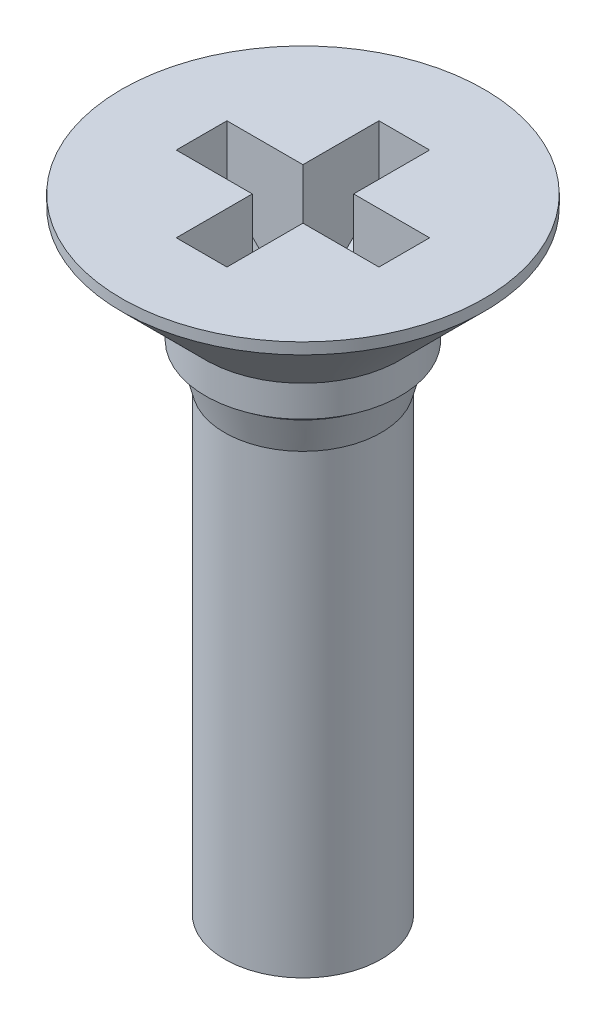
ISO-10303-21;
HEADER;
FILE_DESCRIPTION(('STEP AP214'),'2;1');
FILE_NAME('part.step','',(''),(''),'','','');
FILE_SCHEMA(('AUTOMOTIVE_DESIGN { 1 0 10303 214 1 1 1 1 }'));
ENDSEC;
DATA;
#1=APPLICATION_CONTEXT('core data for automotive mechanical design processes');
#2=APPLICATION_PROTOCOL_DEFINITION('international standard','automotive_design',2000,#1);
#3=PRODUCT_CONTEXT('',#1,'mechanical');
#4=PRODUCT('Part','Part','',(#3));
#5=PRODUCT_RELATED_PRODUCT_CATEGORY('part','',(#4));
#6=PRODUCT_DEFINITION_FORMATION('','',#4);
#7=PRODUCT_DEFINITION_CONTEXT('part definition',#1,'design');
#8=PRODUCT_DEFINITION('design','',#6,#7);
#9=PRODUCT_DEFINITION_SHAPE('','',#8);
#10=(LENGTH_UNIT() NAMED_UNIT(*) SI_UNIT(.MILLI.,.METRE.));
#11=(NAMED_UNIT(*) PLANE_ANGLE_UNIT() SI_UNIT($,.RADIAN.));
#12=(NAMED_UNIT(*) SI_UNIT($,.STERADIAN.) SOLID_ANGLE_UNIT());
#13=UNCERTAINTY_MEASURE_WITH_UNIT(LENGTH_MEASURE(1.E-05),#10,'distance_accuracy_value','');
#14=(GEOMETRIC_REPRESENTATION_CONTEXT(3) GLOBAL_UNCERTAINTY_ASSIGNED_CONTEXT((#13)) GLOBAL_UNIT_ASSIGNED_CONTEXT((#10,
#11,#12)) REPRESENTATION_CONTEXT('',''));
#15=CARTESIAN_POINT('',(0.,0.,0.));
#16=DIRECTION('',(0.,0.,1.));
#17=DIRECTION('',(1.,0.,0.));
#18=AXIS2_PLACEMENT_3D('',#15,#16,#17);
#19=CARTESIAN_POINT('',(0.,-4.2,-0.65));
#20=DIRECTION('',(0.,0.,-1.));
#21=DIRECTION('',(-1.,0.,0.));
#22=AXIS2_PLACEMENT_3D('',#19,#20,#21);
#23=PLANE('',#22);
#24=DIRECTION('',(0.,1.,0.));
#25=VECTOR('',#24,1.);
#26=CARTESIAN_POINT('',(0.65,-4.2,-0.65));
#27=LINE('',#26,#25);
#28=CARTESIAN_POINT('',(0.65,-3.2,-0.65));
#29=VERTEX_POINT('',#28);
#30=CARTESIAN_POINT('',(0.65,0.,-0.65));
#31=VERTEX_POINT('',#30);
#32=EDGE_CURVE('E197',#29,#31,#27,.T.);
#33=ORIENTED_EDGE('',*,*,#32,.F.);
#34=DIRECTION('',(1.,0.,0.));
#35=VECTOR('',#34,1.);
#36=CARTESIAN_POINT('',(-1.,-3.2,-0.65));
#37=LINE('',#36,#35);
#38=CARTESIAN_POINT('',(1.,-3.2,-0.65));
#39=VERTEX_POINT('',#38);
#40=EDGE_CURVE('E232',#29,#39,#37,.T.);
#41=ORIENTED_EDGE('',*,*,#40,.T.);
#42=DIRECTION('',(0.707106781186547,0.707106781186548,0.));
#43=VECTOR('',#42,1.);
#44=CARTESIAN_POINT('',(2.6,-1.6,-0.65));
#45=LINE('',#44,#43);
#46=CARTESIAN_POINT('',(2.6,-1.6,-0.65));
#47=VERTEX_POINT('',#46);
#48=EDGE_CURVE('E236',#39,#47,#45,.T.);
#49=ORIENTED_EDGE('',*,*,#48,.T.);
#50=DIRECTION('',(0.,1.,0.));
#51=VECTOR('',#50,1.);
#52=CARTESIAN_POINT('',(2.6,0.,-0.65));
#53=LINE('',#52,#51);
#54=CARTESIAN_POINT('',(2.6,0.,-0.65));
#55=VERTEX_POINT('',#54);
#56=EDGE_CURVE('E239',#47,#55,#53,.T.);
#57=ORIENTED_EDGE('',*,*,#56,.T.);
#58=DIRECTION('',(-1.,0.,0.));
#59=VECTOR('',#58,1.);
#60=CARTESIAN_POINT('',(2.6,0.,-0.65));
#61=LINE('',#60,#59);
#62=EDGE_CURVE('E243',#55,#31,#61,.T.);
#63=ORIENTED_EDGE('',*,*,#62,.T.);
#64=EDGE_LOOP('',(#33,#41,#49,#57,#63));
#65=FACE_BOUND('',#64,.T.);
#66=ADVANCED_FACE('F35',(#65),#23,.F.);
#67=CARTESIAN_POINT('',(0.,-4.2,0.65));
#68=DIRECTION('',(0.,0.,-1.));
#69=DIRECTION('',(-1.,0.,0.));
#70=AXIS2_PLACEMENT_3D('',#67,#68,#69);
#71=PLANE('',#70);
#72=DIRECTION('',(1.,0.,0.));
#73=VECTOR('',#72,1.);
#74=CARTESIAN_POINT('',(-1.,-3.2,0.65));
#75=LINE('',#74,#73);
#76=CARTESIAN_POINT('',(0.65,-3.2,0.65));
#77=VERTEX_POINT('',#76);
#78=CARTESIAN_POINT('',(1.,-3.2,0.65));
#79=VERTEX_POINT('',#78);
#80=EDGE_CURVE('E214',#77,#79,#75,.T.);
#81=ORIENTED_EDGE('',*,*,#80,.F.);
#82=DIRECTION('',(0.,1.,0.));
#83=VECTOR('',#82,1.);
#84=CARTESIAN_POINT('',(0.65,-4.2,0.65));
#85=LINE('',#84,#83);
#86=CARTESIAN_POINT('',(0.65,0.,0.65));
#87=VERTEX_POINT('',#86);
#88=EDGE_CURVE('E43',#77,#87,#85,.T.);
#89=ORIENTED_EDGE('',*,*,#88,.T.);
#90=DIRECTION('',(-1.,0.,0.));
#91=VECTOR('',#90,1.);
#92=CARTESIAN_POINT('',(2.6,0.,0.65));
#93=LINE('',#92,#91);
#94=CARTESIAN_POINT('',(2.6,0.,0.65));
#95=VERTEX_POINT('',#94);
#96=EDGE_CURVE('E223',#95,#87,#93,.T.);
#97=ORIENTED_EDGE('',*,*,#96,.F.);
#98=DIRECTION('',(0.,1.,0.));
#99=VECTOR('',#98,1.);
#100=CARTESIAN_POINT('',(2.6,0.,0.65));
#101=LINE('',#100,#99);
#102=CARTESIAN_POINT('',(2.6,-1.6,0.65));
#103=VERTEX_POINT('',#102);
#104=EDGE_CURVE('E220',#103,#95,#101,.T.);
#105=ORIENTED_EDGE('',*,*,#104,.F.);
#106=DIRECTION('',(0.707106781186547,0.707106781186548,0.));
#107=VECTOR('',#106,1.);
#108=CARTESIAN_POINT('',(2.6,-1.6,0.65));
#109=LINE('',#108,#107);
#110=EDGE_CURVE('E217',#79,#103,#109,.T.);
#111=ORIENTED_EDGE('',*,*,#110,.F.);
#112=EDGE_LOOP('',(#81,#89,#97,#105,#111));
#113=FACE_BOUND('',#112,.T.);
#114=ADVANCED_FACE('F289',(#113),#71,.T.);
#115=CARTESIAN_POINT('',(0.,0.,0.));
#116=DIRECTION('',(0.,-1.,0.));
#117=DIRECTION('',(1.,0.,0.));
#118=AXIS2_PLACEMENT_3D('',#115,#116,#117);
#119=PLANE('',#118);
#120=DIRECTION('',(1.,0.,0.));
#121=VECTOR('',#120,1.);
#122=CARTESIAN_POINT('',(-0.65,0.,2.6));
#123=LINE('',#122,#121);
#124=CARTESIAN_POINT('',(-0.65,0.,2.6));
#125=VERTEX_POINT('',#124);
#126=CARTESIAN_POINT('',(0.65,0.,2.6));
#127=VERTEX_POINT('',#126);
#128=EDGE_CURVE('E198',#125,#127,#123,.T.);
#129=ORIENTED_EDGE('',*,*,#128,.F.);
#130=DIRECTION('',(0.,0.,1.));
#131=VECTOR('',#130,1.);
#132=CARTESIAN_POINT('',(-0.65,0.,-2.6));
#133=LINE('',#132,#131);
#134=CARTESIAN_POINT('',(-0.65,0.,0.65));
#135=VERTEX_POINT('',#134);
#136=EDGE_CURVE('E191',#135,#125,#133,.T.);
#137=ORIENTED_EDGE('',*,*,#136,.F.);
#138=CARTESIAN_POINT('',(-2.6,0.,0.65));
#139=VERTEX_POINT('',#138);
#140=EDGE_CURVE('E222',#135,#139,#93,.T.);
#141=ORIENTED_EDGE('',*,*,#140,.T.);
#142=DIRECTION('',(0.,0.,1.));
#143=VECTOR('',#142,1.);
#144=CARTESIAN_POINT('',(-2.6,0.,-0.65));
#145=LINE('',#144,#143);
#146=CARTESIAN_POINT('',(-2.6,0.,-0.65));
#147=VERTEX_POINT('',#146);
#148=EDGE_CURVE('E253',#147,#139,#145,.T.);
#149=ORIENTED_EDGE('',*,*,#148,.F.);
#150=CARTESIAN_POINT('',(-0.65,0.,-0.65));
#151=VERTEX_POINT('',#150);
#152=EDGE_CURVE('E242',#151,#147,#61,.T.);
#153=ORIENTED_EDGE('',*,*,#152,.F.);
#154=CARTESIAN_POINT('',(-0.65,0.,-2.6));
#155=VERTEX_POINT('',#154);
#156=EDGE_CURVE('E192',#155,#151,#133,.T.);
#157=ORIENTED_EDGE('',*,*,#156,.F.);
#158=DIRECTION('',(1.,0.,0.));
#159=VECTOR('',#158,1.);
#160=CARTESIAN_POINT('',(-0.65,0.,-2.6));
#161=LINE('',#160,#159);
#162=CARTESIAN_POINT('',(0.65,0.,-2.6));
#163=VERTEX_POINT('',#162);
#164=EDGE_CURVE('E200',#155,#163,#161,.T.);
#165=ORIENTED_EDGE('',*,*,#164,.T.);
#166=DIRECTION('',(0.,0.,1.));
#167=VECTOR('',#166,1.);
#168=CARTESIAN_POINT('',(0.65,0.,-2.6));
#169=LINE('',#168,#167);
#170=EDGE_CURVE('E176',#163,#31,#169,.T.);
#171=ORIENTED_EDGE('',*,*,#170,.T.);
#172=ORIENTED_EDGE('',*,*,#62,.F.);
#173=DIRECTION('',(0.,0.,1.));
#174=VECTOR('',#173,1.);
#175=CARTESIAN_POINT('',(2.6,0.,-0.65));
#176=LINE('',#175,#174);
#177=EDGE_CURVE('E256',#55,#95,#176,.T.);
#178=ORIENTED_EDGE('',*,*,#177,.T.);
#179=ORIENTED_EDGE('',*,*,#96,.T.);
#180=EDGE_CURVE('E58',#87,#127,#169,.T.);
#181=ORIENTED_EDGE('',*,*,#180,.T.);
#182=EDGE_LOOP('',(#129,#137,#141,#149,#153,#157,#165,#171,#172,#178,#179,#181));
#183=FACE_BOUND('',#182,.T.);
#184=CARTESIAN_POINT('',(0.,0.,0.));
#185=DIRECTION('',(0.,1.,0.));
#186=DIRECTION('',(-1.,0.,0.));
#187=AXIS2_PLACEMENT_3D('',#184,#185,#186);
#188=CIRCLE('',#187,4.65);
#189=CARTESIAN_POINT('',(-4.65,0.,0.));
#190=VERTEX_POINT('',#189);
#191=EDGE_CURVE('E285',#190,#190,#188,.T.);
#192=ORIENTED_EDGE('',*,*,#191,.T.);
#193=EDGE_LOOP('',(#192));
#194=FACE_BOUND('',#193,.T.);
#195=ADVANCED_FACE('F37',(#183,#194),#119,.F.);
#196=CARTESIAN_POINT('',(0.,0.,0.));
#197=DIRECTION('',(0.,1.,0.));
#198=DIRECTION('',(-1.,0.,0.));
#199=AXIS2_PLACEMENT_3D('',#196,#197,#198);
#200=CYLINDRICAL_SURFACE('',#199,4.65);
#201=ORIENTED_EDGE('',*,*,#191,.F.);
#202=EDGE_LOOP('',(#201));
#203=FACE_BOUND('',#202,.T.);
#204=CARTESIAN_POINT('',(0.,-0.290000000000009,0.));
#205=DIRECTION('',(0.,1.,0.));
#206=DIRECTION('',(-1.,0.,0.));
#207=AXIS2_PLACEMENT_3D('',#204,#205,#206);
#208=CIRCLE('',#207,4.65);
#209=CARTESIAN_POINT('',(-4.65,-0.290000000000009,0.));
#210=VERTEX_POINT('',#209);
#211=EDGE_CURVE('E282',#210,#210,#208,.T.);
#212=ORIENTED_EDGE('',*,*,#211,.T.);
#213=EDGE_LOOP('',(#212));
#214=FACE_BOUND('',#213,.T.);
#215=ADVANCED_FACE('F398',(#203,#214),#200,.T.);
#216=CARTESIAN_POINT('',(0.,-2.44,0.));
#217=DIRECTION('',(0.,1.,0.));
#218=DIRECTION('',(-1.,0.,0.));
#219=AXIS2_PLACEMENT_3D('',#216,#217,#218);
#220=CONICAL_SURFACE('',#219,2.5,0.78539816339745);
#221=ORIENTED_EDGE('',*,*,#211,.F.);
#222=EDGE_LOOP('',(#221));
#223=FACE_BOUND('',#222,.T.);
#224=CARTESIAN_POINT('',(0.,-2.44,0.));
#225=DIRECTION('',(0.,1.,0.));
#226=DIRECTION('',(-1.,0.,0.));
#227=AXIS2_PLACEMENT_3D('',#224,#225,#226);
#228=CIRCLE('',#227,2.5);
#229=CARTESIAN_POINT('',(-2.5,-2.44,0.));
#230=VERTEX_POINT('',#229);
#231=EDGE_CURVE('E279',#230,#230,#228,.T.);
#232=ORIENTED_EDGE('',*,*,#231,.T.);
#233=EDGE_LOOP('',(#232));
#234=FACE_BOUND('',#233,.T.);
#235=ADVANCED_FACE('F395',(#223,#234),#220,.T.);
#236=CARTESIAN_POINT('',(0.,0.,0.));
#237=DIRECTION('',(0.,1.,0.));
#238=DIRECTION('',(-1.,0.,0.));
#239=AXIS2_PLACEMENT_3D('',#236,#237,#238);
#240=CYLINDRICAL_SURFACE('',#239,2.5);
#241=ORIENTED_EDGE('',*,*,#231,.F.);
#242=EDGE_LOOP('',(#241));
#243=FACE_BOUND('',#242,.T.);
#244=CARTESIAN_POINT('',(0.,-3.24,0.));
#245=DIRECTION('',(0.,1.,0.));
#246=DIRECTION('',(-1.,0.,0.));
#247=AXIS2_PLACEMENT_3D('',#244,#245,#246);
#248=CIRCLE('',#247,2.5);
#249=CARTESIAN_POINT('',(-2.5,-3.24,0.));
#250=VERTEX_POINT('',#249);
#251=EDGE_CURVE('E276',#250,#250,#248,.T.);
#252=ORIENTED_EDGE('',*,*,#251,.T.);
#253=EDGE_LOOP('',(#252));
#254=FACE_BOUND('',#253,.T.);
#255=ADVANCED_FACE('F391',(#243,#254),#240,.T.);
#256=CARTESIAN_POINT('',(2.5,-3.24,0.));
#257=DIRECTION('',(0.,1.,0.));
#258=DIRECTION('',(-1.,0.,0.));
#259=AXIS2_PLACEMENT_3D('',#256,#257,#258);
#260=PLANE('',#259);
#261=ORIENTED_EDGE('',*,*,#251,.F.);
#262=EDGE_LOOP('',(#261));
#263=FACE_BOUND('',#262,.T.);
#264=CARTESIAN_POINT('',(0.,-3.24,0.));
#265=DIRECTION('',(0.,1.,0.));
#266=DIRECTION('',(-1.,0.,0.));
#267=AXIS2_PLACEMENT_3D('',#264,#265,#266);
#268=CIRCLE('',#267,2.24);
#269=CARTESIAN_POINT('',(-2.24,-3.24,0.));
#270=VERTEX_POINT('',#269);
#271=EDGE_CURVE('E273',#270,#270,#268,.T.);
#272=ORIENTED_EDGE('',*,*,#271,.T.);
#273=EDGE_LOOP('',(#272));
#274=FACE_BOUND('',#273,.T.);
#275=ADVANCED_FACE('F387',(#263,#274),#260,.F.);
#276=CARTESIAN_POINT('',(0.,0.,0.));
#277=DIRECTION('',(0.,1.,0.));
#278=DIRECTION('',(-1.,0.,0.));
#279=AXIS2_PLACEMENT_3D('',#276,#277,#278);
#280=CYLINDRICAL_SURFACE('',#279,2.24);
#281=ORIENTED_EDGE('',*,*,#271,.F.);
#282=EDGE_LOOP('',(#281));
#283=FACE_BOUND('',#282,.T.);
#284=CARTESIAN_POINT('',(0.,-3.43976228885538,0.));
#285=DIRECTION('',(0.,1.,0.));
#286=DIRECTION('',(-1.,0.,0.));
#287=AXIS2_PLACEMENT_3D('',#284,#285,#286);
#288=CIRCLE('',#287,2.24);
#289=CARTESIAN_POINT('',(-2.24,-3.43976228885538,0.));
#290=VERTEX_POINT('',#289);
#291=EDGE_CURVE('E270',#290,#290,#288,.T.);
#292=ORIENTED_EDGE('',*,*,#291,.T.);
#293=EDGE_LOOP('',(#292));
#294=FACE_BOUND('',#293,.T.);
#295=ADVANCED_FACE('F383',(#283,#294),#280,.T.);
#296=CARTESIAN_POINT('',(0.,-4.3,0.));
#297=DIRECTION('',(0.,1.,0.));
#298=DIRECTION('',(-1.,0.,0.));
#299=AXIS2_PLACEMENT_3D('',#296,#297,#298);
#300=CONICAL_SURFACE('',#299,2.0095,0.26179938779915);
#301=ORIENTED_EDGE('',*,*,#291,.F.);
#302=EDGE_LOOP('',(#301));
#303=FACE_BOUND('',#302,.T.);
#304=CARTESIAN_POINT('',(0.,-4.3,0.));
#305=DIRECTION('',(0.,1.,0.));
#306=DIRECTION('',(-1.,0.,0.));
#307=AXIS2_PLACEMENT_3D('',#304,#305,#306);
#308=CIRCLE('',#307,2.0095);
#309=CARTESIAN_POINT('',(-2.0095,-4.3,0.));
#310=VERTEX_POINT('',#309);
#311=EDGE_CURVE('E267',#310,#310,#308,.T.);
#312=ORIENTED_EDGE('',*,*,#311,.T.);
#313=EDGE_LOOP('',(#312));
#314=FACE_BOUND('',#313,.T.);
#315=ADVANCED_FACE('F379',(#303,#314),#300,.T.);
#316=CARTESIAN_POINT('',(0.,0.,0.));
#317=DIRECTION('',(0.,1.,0.));
#318=DIRECTION('',(-1.,0.,0.));
#319=AXIS2_PLACEMENT_3D('',#316,#317,#318);
#320=CYLINDRICAL_SURFACE('',#319,2.0095);
#321=ORIENTED_EDGE('',*,*,#311,.F.);
#322=EDGE_LOOP('',(#321));
#323=FACE_BOUND('',#322,.T.);
#324=CARTESIAN_POINT('',(0.,-16.,0.));
#325=DIRECTION('',(0.,1.,0.));
#326=DIRECTION('',(-1.,0.,0.));
#327=AXIS2_PLACEMENT_3D('',#324,#325,#326);
#328=CIRCLE('',#327,2.0095);
#329=CARTESIAN_POINT('',(-2.0095,-16.,0.));
#330=VERTEX_POINT('',#329);
#331=EDGE_CURVE('E252',#330,#330,#328,.T.);
#332=ORIENTED_EDGE('',*,*,#331,.T.);
#333=EDGE_LOOP('',(#332));
#334=FACE_BOUND('',#333,.T.);
#335=ADVANCED_FACE('F375',(#323,#334),#320,.T.);
#336=CARTESIAN_POINT('',(2.0095,-16.,0.));
#337=DIRECTION('',(0.,1.,0.));
#338=DIRECTION('',(-1.,0.,0.));
#339=AXIS2_PLACEMENT_3D('',#336,#337,#338);
#340=PLANE('',#339);
#341=ORIENTED_EDGE('',*,*,#331,.F.);
#342=EDGE_LOOP('',(#341));
#343=FACE_BOUND('',#342,.T.);
#344=ADVANCED_FACE('F372',(#343),#340,.F.);
#345=CARTESIAN_POINT('',(-2.6,-1.6,-0.65));
#346=DIRECTION('',(-0.707106781186548,-0.707106781186547,0.));
#347=DIRECTION('',(0.707106781186547,-0.707106781186548,0.));
#348=AXIS2_PLACEMENT_3D('',#345,#346,#347);
#349=PLANE('',#348);
#350=DIRECTION('',(0.,0.,1.));
#351=VECTOR('',#350,1.);
#352=CARTESIAN_POINT('',(-1.,-3.2,-0.65));
#353=LINE('',#352,#351);
#354=CARTESIAN_POINT('',(-1.,-3.2,-0.65));
#355=VERTEX_POINT('',#354);
#356=CARTESIAN_POINT('',(-1.,-3.2,0.65));
#357=VERTEX_POINT('',#356);
#358=EDGE_CURVE('E249',#355,#357,#353,.T.);
#359=ORIENTED_EDGE('',*,*,#358,.F.);
#360=DIRECTION('',(0.707106781186547,-0.707106781186548,0.));
#361=VECTOR('',#360,1.);
#362=CARTESIAN_POINT('',(-2.6,-1.6,-0.65));
#363=LINE('',#362,#361);
#364=CARTESIAN_POINT('',(-2.6,-1.6,-0.65));
#365=VERTEX_POINT('',#364);
#366=EDGE_CURVE('E229',#365,#355,#363,.T.);
#367=ORIENTED_EDGE('',*,*,#366,.F.);
#368=DIRECTION('',(0.,0.,1.));
#369=VECTOR('',#368,1.);
#370=CARTESIAN_POINT('',(-2.6,-1.6,-0.65));
#371=LINE('',#370,#369);
#372=CARTESIAN_POINT('',(-2.6,-1.6,0.65));
#373=VERTEX_POINT('',#372);
#374=EDGE_CURVE('E250',#365,#373,#371,.T.);
#375=ORIENTED_EDGE('',*,*,#374,.T.);
#376=DIRECTION('',(0.707106781186547,-0.707106781186548,0.));
#377=VECTOR('',#376,1.);
#378=CARTESIAN_POINT('',(-2.6,-1.6,0.65));
#379=LINE('',#378,#377);
#380=EDGE_CURVE('E211',#373,#357,#379,.T.);
#381=ORIENTED_EDGE('',*,*,#380,.T.);
#382=EDGE_LOOP('',(#359,#367,#375,#381));
#383=FACE_BOUND('',#382,.T.);
#384=ADVANCED_FACE('F326',(#383),#349,.F.);
#385=CARTESIAN_POINT('',(-2.6,0.,-0.65));
#386=DIRECTION('',(-1.,0.,0.));
#387=DIRECTION('',(0.,0.,1.));
#388=AXIS2_PLACEMENT_3D('',#385,#386,#387);
#389=PLANE('',#388);
#390=ORIENTED_EDGE('',*,*,#374,.F.);
#391=DIRECTION('',(0.,-1.,0.));
#392=VECTOR('',#391,1.);
#393=CARTESIAN_POINT('',(-2.6,0.,-0.65));
#394=LINE('',#393,#392);
#395=EDGE_CURVE('E246',#147,#365,#394,.T.);
#396=ORIENTED_EDGE('',*,*,#395,.F.);
#397=ORIENTED_EDGE('',*,*,#148,.T.);
#398=DIRECTION('',(0.,-1.,0.));
#399=VECTOR('',#398,1.);
#400=CARTESIAN_POINT('',(-2.6,0.,0.65));
#401=LINE('',#400,#399);
#402=EDGE_CURVE('E226',#139,#373,#401,.T.);
#403=ORIENTED_EDGE('',*,*,#402,.T.);
#404=EDGE_LOOP('',(#390,#396,#397,#403));
#405=FACE_BOUND('',#404,.T.);
#406=ADVANCED_FACE('F371',(#405),#389,.F.);
#407=CARTESIAN_POINT('',(2.6,0.,-0.65));
#408=DIRECTION('',(1.,0.,0.));
#409=DIRECTION('',(0.,0.,-1.));
#410=AXIS2_PLACEMENT_3D('',#407,#408,#409);
#411=PLANE('',#410);
#412=ORIENTED_EDGE('',*,*,#177,.F.);
#413=ORIENTED_EDGE('',*,*,#56,.F.);
#414=DIRECTION('',(0.,0.,1.));
#415=VECTOR('',#414,1.);
#416=CARTESIAN_POINT('',(2.6,-1.6,-0.65));
#417=LINE('',#416,#415);
#418=EDGE_CURVE('E259',#47,#103,#417,.T.);
#419=ORIENTED_EDGE('',*,*,#418,.T.);
#420=ORIENTED_EDGE('',*,*,#104,.T.);
#421=EDGE_LOOP('',(#412,#413,#419,#420));
#422=FACE_BOUND('',#421,.T.);
#423=ADVANCED_FACE('F298',(#422),#411,.F.);
#424=CARTESIAN_POINT('',(2.6,-1.6,-0.65));
#425=DIRECTION('',(0.707106781186548,-0.707106781186547,0.));
#426=DIRECTION('',(0.707106781186547,0.707106781186548,0.));
#427=AXIS2_PLACEMENT_3D('',#424,#425,#426);
#428=PLANE('',#427);
#429=ORIENTED_EDGE('',*,*,#418,.F.);
#430=ORIENTED_EDGE('',*,*,#48,.F.);
#431=DIRECTION('',(0.,0.,1.));
#432=VECTOR('',#431,1.);
#433=CARTESIAN_POINT('',(1.,-3.2,-0.65));
#434=LINE('',#433,#432);
#435=EDGE_CURVE('E261',#39,#79,#434,.T.);
#436=ORIENTED_EDGE('',*,*,#435,.T.);
#437=ORIENTED_EDGE('',*,*,#110,.T.);
#438=EDGE_LOOP('',(#429,#430,#436,#437));
#439=FACE_BOUND('',#438,.T.);
#440=ADVANCED_FACE('F304',(#439),#428,.F.);
#441=CARTESIAN_POINT('',(-1.,-3.2,-0.65));
#442=DIRECTION('',(0.,-1.,0.));
#443=DIRECTION('',(0.,0.,-1.));
#444=AXIS2_PLACEMENT_3D('',#441,#442,#443);
#445=PLANE('',#444);
#446=CARTESIAN_POINT('',(-0.65,-3.2,0.65));
#447=VERTEX_POINT('',#446);
#448=EDGE_CURVE('E215',#357,#447,#75,.T.);
#449=ORIENTED_EDGE('',*,*,#448,.T.);
#450=DIRECTION('',(0.,0.,-1.));
#451=VECTOR('',#450,1.);
#452=CARTESIAN_POINT('',(-0.65,-3.2,1.));
#453=LINE('',#452,#451);
#454=CARTESIAN_POINT('',(-0.65,-3.2,1.));
#455=VERTEX_POINT('',#454);
#456=EDGE_CURVE('E154',#455,#447,#453,.T.);
#457=ORIENTED_EDGE('',*,*,#456,.F.);
#458=DIRECTION('',(1.,0.,0.));
#459=VECTOR('',#458,1.);
#460=CARTESIAN_POINT('',(-0.65,-3.2,1.));
#461=LINE('',#460,#459);
#462=CARTESIAN_POINT('',(0.65,-3.2,1.));
#463=VERTEX_POINT('',#462);
#464=EDGE_CURVE('E148',#455,#463,#461,.T.);
#465=ORIENTED_EDGE('',*,*,#464,.T.);
#466=DIRECTION('',(0.,0.,-1.));
#467=VECTOR('',#466,1.);
#468=CARTESIAN_POINT('',(0.65,-3.2,1.));
#469=LINE('',#468,#467);
#470=EDGE_CURVE('E152',#463,#77,#469,.T.);
#471=ORIENTED_EDGE('',*,*,#470,.T.);
#472=ORIENTED_EDGE('',*,*,#80,.T.);
#473=ORIENTED_EDGE('',*,*,#435,.F.);
#474=ORIENTED_EDGE('',*,*,#40,.F.);
#475=CARTESIAN_POINT('',(0.65,-3.2,-1.));
#476=VERTEX_POINT('',#475);
#477=EDGE_CURVE('E50',#29,#476,#469,.T.);
#478=ORIENTED_EDGE('',*,*,#477,.T.);
#479=DIRECTION('',(1.,0.,0.));
#480=VECTOR('',#479,1.);
#481=CARTESIAN_POINT('',(-0.65,-3.2,-1.));
#482=LINE('',#481,#480);
#483=CARTESIAN_POINT('',(-0.65,-3.2,-1.));
#484=VERTEX_POINT('',#483);
#485=EDGE_CURVE('E159',#484,#476,#482,.T.);
#486=ORIENTED_EDGE('',*,*,#485,.F.);
#487=CARTESIAN_POINT('',(-0.65,-3.2,-0.65));
#488=VERTEX_POINT('',#487);
#489=EDGE_CURVE('E183',#488,#484,#453,.T.);
#490=ORIENTED_EDGE('',*,*,#489,.F.);
#491=EDGE_CURVE('E233',#355,#488,#37,.T.);
#492=ORIENTED_EDGE('',*,*,#491,.F.);
#493=ORIENTED_EDGE('',*,*,#358,.T.);
#494=EDGE_LOOP('',(#449,#457,#465,#471,#472,#473,#474,#478,#486,#490,#492,#493));
#495=FACE_BOUND('',#494,.T.);
#496=ADVANCED_FACE('F151',(#495),#445,.F.);
#497=ORIENTED_EDGE('',*,*,#491,.T.);
#498=DIRECTION('',(0.,1.,0.));
#499=VECTOR('',#498,1.);
#500=CARTESIAN_POINT('',(-0.65,-4.2,-0.65));
#501=LINE('',#500,#499);
#502=EDGE_CURVE('E208',#488,#151,#501,.T.);
#503=ORIENTED_EDGE('',*,*,#502,.T.);
#504=ORIENTED_EDGE('',*,*,#152,.T.);
#505=ORIENTED_EDGE('',*,*,#395,.T.);
#506=ORIENTED_EDGE('',*,*,#366,.T.);
#507=EDGE_LOOP('',(#497,#503,#504,#505,#506));
#508=FACE_BOUND('',#507,.T.);
#509=ADVANCED_FACE('F321',(#508),#23,.F.);
#510=DIRECTION('',(0.,1.,0.));
#511=VECTOR('',#510,1.);
#512=CARTESIAN_POINT('',(-0.65,-4.2,0.65));
#513=LINE('',#512,#511);
#514=EDGE_CURVE('E11',#447,#135,#513,.T.);
#515=ORIENTED_EDGE('',*,*,#514,.F.);
#516=ORIENTED_EDGE('',*,*,#448,.F.);
#517=ORIENTED_EDGE('',*,*,#380,.F.);
#518=ORIENTED_EDGE('',*,*,#402,.F.);
#519=ORIENTED_EDGE('',*,*,#140,.F.);
#520=EDGE_LOOP('',(#515,#516,#517,#518,#519));
#521=FACE_BOUND('',#520,.T.);
#522=ADVANCED_FACE('F331',(#521),#71,.T.);
#523=CARTESIAN_POINT('',(-0.65,-1.6,2.6));
#524=DIRECTION('',(0.,-0.707106781186547,0.707106781186548));
#525=DIRECTION('',(0.,-0.707106781186548,-0.707106781186547));
#526=AXIS2_PLACEMENT_3D('',#523,#524,#525);
#527=PLANE('',#526);
#528=ORIENTED_EDGE('',*,*,#464,.F.);
#529=DIRECTION('',(0.,-0.707106781186548,-0.707106781186547));
#530=VECTOR('',#529,1.);
#531=CARTESIAN_POINT('',(-0.65,-1.6,2.6));
#532=LINE('',#531,#530);
#533=CARTESIAN_POINT('',(-0.65,-1.6,2.6));
#534=VERTEX_POINT('',#533);
#535=EDGE_CURVE('E181',#534,#455,#532,.T.);
#536=ORIENTED_EDGE('',*,*,#535,.F.);
#537=DIRECTION('',(1.,0.,0.));
#538=VECTOR('',#537,1.);
#539=CARTESIAN_POINT('',(-0.65,-1.6,2.6));
#540=LINE('',#539,#538);
#541=CARTESIAN_POINT('',(0.65,-1.6,2.6));
#542=VERTEX_POINT('',#541);
#543=EDGE_CURVE('E168',#534,#542,#540,.T.);
#544=ORIENTED_EDGE('',*,*,#543,.T.);
#545=DIRECTION('',(0.,-0.707106781186548,-0.707106781186547));
#546=VECTOR('',#545,1.);
#547=CARTESIAN_POINT('',(0.65,-1.6,2.6));
#548=LINE('',#547,#546);
#549=EDGE_CURVE('E164',#542,#463,#548,.T.);
#550=ORIENTED_EDGE('',*,*,#549,.T.);
#551=EDGE_LOOP('',(#528,#536,#544,#550));
#552=FACE_BOUND('',#551,.T.);
#553=ADVANCED_FACE('F167',(#552),#527,.F.);
#554=CARTESIAN_POINT('',(-0.65,-4.2,0.));
#555=DIRECTION('',(-1.,0.,0.));
#556=DIRECTION('',(0.,0.,1.));
#557=AXIS2_PLACEMENT_3D('',#554,#555,#556);
#558=PLANE('',#557);
#559=ORIENTED_EDGE('',*,*,#514,.T.);
#560=ORIENTED_EDGE('',*,*,#136,.T.);
#561=DIRECTION('',(0.,-1.,0.));
#562=VECTOR('',#561,1.);
#563=CARTESIAN_POINT('',(-0.65,0.,2.6));
#564=LINE('',#563,#562);
#565=EDGE_CURVE('E160',#125,#534,#564,.T.);
#566=ORIENTED_EDGE('',*,*,#565,.T.);
#567=ORIENTED_EDGE('',*,*,#535,.T.);
#568=ORIENTED_EDGE('',*,*,#456,.T.);
#569=EDGE_LOOP('',(#559,#560,#566,#567,#568));
#570=FACE_BOUND('',#569,.T.);
#571=ADVANCED_FACE('F336',(#570),#558,.F.);
#572=CARTESIAN_POINT('',(0.65,-4.2,0.));
#573=DIRECTION('',(-1.,0.,0.));
#574=DIRECTION('',(0.,0.,1.));
#575=AXIS2_PLACEMENT_3D('',#572,#573,#574);
#576=PLANE('',#575);
#577=ORIENTED_EDGE('',*,*,#470,.F.);
#578=ORIENTED_EDGE('',*,*,#549,.F.);
#579=DIRECTION('',(0.,-1.,0.));
#580=VECTOR('',#579,1.);
#581=CARTESIAN_POINT('',(0.65,0.,2.6));
#582=LINE('',#581,#580);
#583=EDGE_CURVE('E179',#127,#542,#582,.T.);
#584=ORIENTED_EDGE('',*,*,#583,.F.);
#585=ORIENTED_EDGE('',*,*,#180,.F.);
#586=ORIENTED_EDGE('',*,*,#88,.F.);
#587=EDGE_LOOP('',(#577,#578,#584,#585,#586));
#588=FACE_BOUND('',#587,.T.);
#589=ADVANCED_FACE('F163',(#588),#576,.T.);
#590=CARTESIAN_POINT('',(-0.65,0.,2.6));
#591=DIRECTION('',(0.,0.,1.));
#592=DIRECTION('',(1.,0.,0.));
#593=AXIS2_PLACEMENT_3D('',#590,#591,#592);
#594=PLANE('',#593);
#595=ORIENTED_EDGE('',*,*,#543,.F.);
#596=ORIENTED_EDGE('',*,*,#565,.F.);
#597=ORIENTED_EDGE('',*,*,#128,.T.);
#598=ORIENTED_EDGE('',*,*,#583,.T.);
#599=EDGE_LOOP('',(#595,#596,#597,#598));
#600=FACE_BOUND('',#599,.T.);
#601=ADVANCED_FACE('F340',(#600),#594,.F.);
#602=ORIENTED_EDGE('',*,*,#489,.T.);
#603=DIRECTION('',(0.,0.707106781186548,-0.707106781186547));
#604=VECTOR('',#603,1.);
#605=CARTESIAN_POINT('',(-0.65,-1.6,-2.6));
#606=LINE('',#605,#604);
#607=CARTESIAN_POINT('',(-0.65,-1.6,-2.6));
#608=VERTEX_POINT('',#607);
#609=EDGE_CURVE('E185',#484,#608,#606,.T.);
#610=ORIENTED_EDGE('',*,*,#609,.T.);
#611=DIRECTION('',(0.,1.,0.));
#612=VECTOR('',#611,1.);
#613=CARTESIAN_POINT('',(-0.65,0.,-2.6));
#614=LINE('',#613,#612);
#615=EDGE_CURVE('E188',#608,#155,#614,.T.);
#616=ORIENTED_EDGE('',*,*,#615,.T.);
#617=ORIENTED_EDGE('',*,*,#156,.T.);
#618=ORIENTED_EDGE('',*,*,#502,.F.);
#619=EDGE_LOOP('',(#602,#610,#616,#617,#618));
#620=FACE_BOUND('',#619,.T.);
#621=ADVANCED_FACE('F318',(#620),#558,.F.);
#622=ORIENTED_EDGE('',*,*,#32,.T.);
#623=ORIENTED_EDGE('',*,*,#170,.F.);
#624=DIRECTION('',(0.,1.,0.));
#625=VECTOR('',#624,1.);
#626=CARTESIAN_POINT('',(0.65,0.,-2.6));
#627=LINE('',#626,#625);
#628=CARTESIAN_POINT('',(0.65,-1.6,-2.6));
#629=VERTEX_POINT('',#628);
#630=EDGE_CURVE('E174',#629,#163,#627,.T.);
#631=ORIENTED_EDGE('',*,*,#630,.F.);
#632=DIRECTION('',(0.,0.707106781186548,-0.707106781186547));
#633=VECTOR('',#632,1.);
#634=CARTESIAN_POINT('',(0.65,-1.6,-2.6));
#635=LINE('',#634,#633);
#636=EDGE_CURVE('E165',#476,#629,#635,.T.);
#637=ORIENTED_EDGE('',*,*,#636,.F.);
#638=ORIENTED_EDGE('',*,*,#477,.F.);
#639=EDGE_LOOP('',(#622,#623,#631,#637,#638));
#640=FACE_BOUND('',#639,.T.);
#641=ADVANCED_FACE('F311',(#640),#576,.T.);
#642=CARTESIAN_POINT('',(-0.65,0.,-2.6));
#643=DIRECTION('',(0.,0.,-1.));
#644=DIRECTION('',(-1.,0.,0.));
#645=AXIS2_PLACEMENT_3D('',#642,#643,#644);
#646=PLANE('',#645);
#647=ORIENTED_EDGE('',*,*,#164,.F.);
#648=ORIENTED_EDGE('',*,*,#615,.F.);
#649=DIRECTION('',(1.,0.,0.));
#650=VECTOR('',#649,1.);
#651=CARTESIAN_POINT('',(-0.65,-1.6,-2.6));
#652=LINE('',#651,#650);
#653=EDGE_CURVE('E203',#608,#629,#652,.T.);
#654=ORIENTED_EDGE('',*,*,#653,.T.);
#655=ORIENTED_EDGE('',*,*,#630,.T.);
#656=EDGE_LOOP('',(#647,#648,#654,#655));
#657=FACE_BOUND('',#656,.T.);
#658=ADVANCED_FACE('F314',(#657),#646,.F.);
#659=CARTESIAN_POINT('',(-0.65,-1.6,-2.6));
#660=DIRECTION('',(0.,-0.707106781186547,-0.707106781186548));
#661=DIRECTION('',(0.,0.707106781186548,-0.707106781186547));
#662=AXIS2_PLACEMENT_3D('',#659,#660,#661);
#663=PLANE('',#662);
#664=ORIENTED_EDGE('',*,*,#653,.F.);
#665=ORIENTED_EDGE('',*,*,#609,.F.);
#666=ORIENTED_EDGE('',*,*,#485,.T.);
#667=ORIENTED_EDGE('',*,*,#636,.T.);
#668=EDGE_LOOP('',(#664,#665,#666,#667));
#669=FACE_BOUND('',#668,.T.);
#670=ADVANCED_FACE('F309',(#669),#663,.F.);
#671=CLOSED_SHELL('',(#66,#114,#195,#215,#235,#255,#275,#295,#315,#335,#344,#384,#406,#423,#440,
#496,#509,#522,#553,#571,#589,#601,#621,#641,#658,#670));
#672=MANIFOLD_SOLID_BREP('B2',#671);
#673=ADVANCED_BREP_SHAPE_REPRESENTATION('',(#18,#672),#14);
#674=SHAPE_DEFINITION_REPRESENTATION(#9,#673);
ENDSEC;
END-ISO-10303-21;
